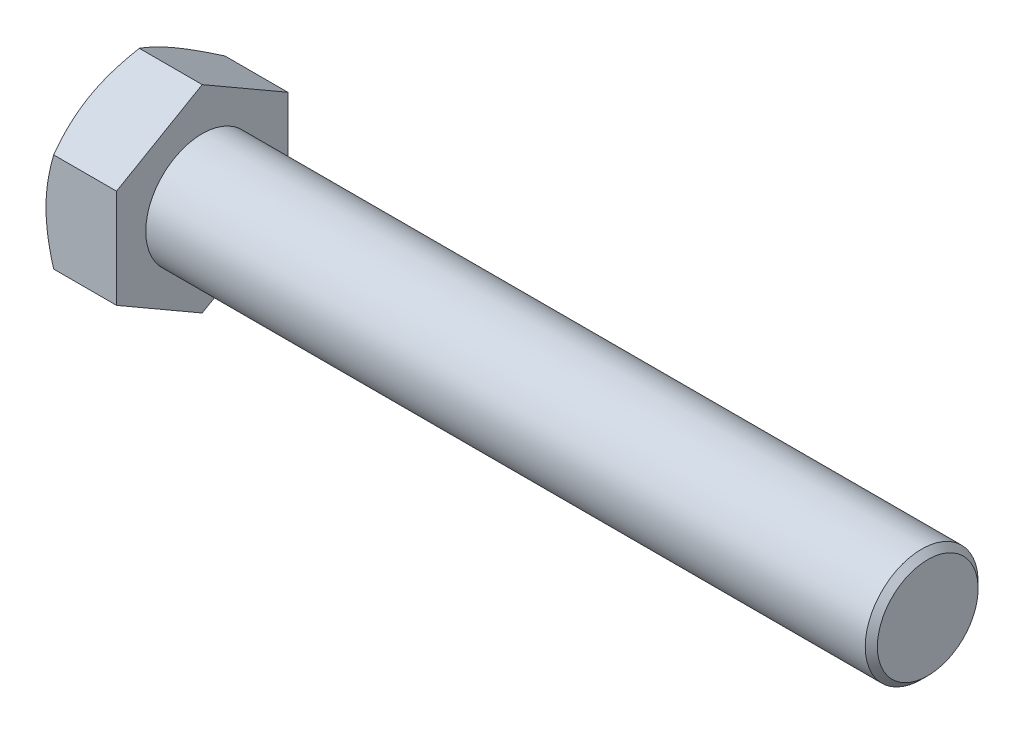
ISO-10303-21;
HEADER;
FILE_DESCRIPTION(('STEP AP214'),'2;1');
FILE_NAME('part.step','',(''),(''),'','','');
FILE_SCHEMA(('AUTOMOTIVE_DESIGN { 1 0 10303 214 1 1 1 1 }'));
ENDSEC;
DATA;
#1=APPLICATION_CONTEXT('core data for automotive mechanical design processes');
#2=APPLICATION_PROTOCOL_DEFINITION('international standard','automotive_design',2000,#1);
#3=PRODUCT_CONTEXT('',#1,'mechanical');
#4=PRODUCT('Part','Part','',(#3));
#5=PRODUCT_RELATED_PRODUCT_CATEGORY('part','',(#4));
#6=PRODUCT_DEFINITION_FORMATION('','',#4);
#7=PRODUCT_DEFINITION_CONTEXT('part definition',#1,'design');
#8=PRODUCT_DEFINITION('design','',#6,#7);
#9=PRODUCT_DEFINITION_SHAPE('','',#8);
#10=(LENGTH_UNIT() NAMED_UNIT(*) SI_UNIT(.MILLI.,.METRE.));
#11=(NAMED_UNIT(*) PLANE_ANGLE_UNIT() SI_UNIT($,.RADIAN.));
#12=(NAMED_UNIT(*) SI_UNIT($,.STERADIAN.) SOLID_ANGLE_UNIT());
#13=UNCERTAINTY_MEASURE_WITH_UNIT(LENGTH_MEASURE(1.E-05),#10,'distance_accuracy_value','');
#14=(GEOMETRIC_REPRESENTATION_CONTEXT(3) GLOBAL_UNCERTAINTY_ASSIGNED_CONTEXT((#13)) GLOBAL_UNIT_ASSIGNED_CONTEXT((#10,
#11,#12)) REPRESENTATION_CONTEXT('',''));
#15=CARTESIAN_POINT('',(0.,0.,0.));
#16=DIRECTION('',(0.,0.,1.));
#17=DIRECTION('',(1.,0.,0.));
#18=AXIS2_PLACEMENT_3D('',#15,#16,#17);
#19=CARTESIAN_POINT('',(35.,73.6121593216773,42.5));
#20=DIRECTION('',(1.,0.,0.));
#21=DIRECTION('',(0.,0.,-1.));
#22=AXIS2_PLACEMENT_3D('',#19,#20,#21);
#23=PLANE('',#22);
#24=DIRECTION('',(0.,0.5,0.866025403784439));
#25=VECTOR('',#24,1.);
#26=CARTESIAN_POINT('',(35.,24.5373864405591,-42.5));
#27=LINE('',#26,#25);
#28=CARTESIAN_POINT('',(35.,24.5373864405591,-42.5));
#29=VERTEX_POINT('',#28);
#30=CARTESIAN_POINT('',(35.,49.0747728811182,0.));
#31=VERTEX_POINT('',#30);
#32=EDGE_CURVE('E156',#29,#31,#27,.T.);
#33=ORIENTED_EDGE('',*,*,#32,.T.);
#34=DIRECTION('',(0.,-0.5,0.866025403784439));
#35=VECTOR('',#34,1.);
#36=CARTESIAN_POINT('',(35.,49.0747728811182,0.));
#37=LINE('',#36,#35);
#38=CARTESIAN_POINT('',(35.,24.5373864405591,42.5));
#39=VERTEX_POINT('',#38);
#40=EDGE_CURVE('E154',#31,#39,#37,.T.);
#41=ORIENTED_EDGE('',*,*,#40,.T.);
#42=DIRECTION('',(0.,-1.,0.));
#43=VECTOR('',#42,1.);
#44=CARTESIAN_POINT('',(35.,24.5373864405591,42.5));
#45=LINE('',#44,#43);
#46=CARTESIAN_POINT('',(35.,-24.5373864405591,42.5));
#47=VERTEX_POINT('',#46);
#48=EDGE_CURVE('E131',#39,#47,#45,.T.);
#49=ORIENTED_EDGE('',*,*,#48,.T.);
#50=DIRECTION('',(0.,-0.5,-0.866025403784438));
#51=VECTOR('',#50,1.);
#52=CARTESIAN_POINT('',(35.,-24.5373864405591,42.5));
#53=LINE('',#52,#51);
#54=CARTESIAN_POINT('',(35.,-49.0747728811182,0.));
#55=VERTEX_POINT('',#54);
#56=EDGE_CURVE('E151',#47,#55,#53,.T.);
#57=ORIENTED_EDGE('',*,*,#56,.T.);
#58=DIRECTION('',(0.,0.5,-0.866025403784439));
#59=VECTOR('',#58,1.);
#60=CARTESIAN_POINT('',(35.,-49.0747728811182,0.));
#61=LINE('',#60,#59);
#62=CARTESIAN_POINT('',(35.,-24.5373864405591,-42.5));
#63=VERTEX_POINT('',#62);
#64=EDGE_CURVE('E149',#55,#63,#61,.T.);
#65=ORIENTED_EDGE('',*,*,#64,.T.);
#66=DIRECTION('',(0.,1.,0.));
#67=VECTOR('',#66,1.);
#68=CARTESIAN_POINT('',(35.,-24.5373864405591,-42.5));
#69=LINE('',#68,#67);
#70=EDGE_CURVE('E147',#63,#29,#69,.T.);
#71=ORIENTED_EDGE('',*,*,#70,.T.);
#72=EDGE_LOOP('',(#33,#41,#49,#57,#65,#71));
#73=FACE_BOUND('',#72,.T.);
#74=CARTESIAN_POINT('',(35.,0.,0.));
#75=DIRECTION('',(1.,0.,0.));
#76=DIRECTION('',(0.,0.,-1.));
#77=AXIS2_PLACEMENT_3D('',#74,#75,#76);
#78=CIRCLE('',#77,28.);
#79=CARTESIAN_POINT('',(35.,0.,-28.));
#80=VERTEX_POINT('',#79);
#81=EDGE_CURVE('E249',#80,#80,#78,.F.);
#82=ORIENTED_EDGE('',*,*,#81,.T.);
#83=EDGE_LOOP('',(#82));
#84=FACE_BOUND('',#83,.T.);
#85=ADVANCED_FACE('F38',(#73,#84),#23,.T.);
#86=CARTESIAN_POINT('',(35.,24.5373864405591,-42.5));
#87=DIRECTION('',(0.,-0.866025403784439,0.5));
#88=DIRECTION('',(0.,-0.5,-0.866025403784439));
#89=AXIS2_PLACEMENT_3D('',#86,#87,#88);
#90=PLANE('',#89);
#91=CARTESIAN_POINT('',(3.79601355967614,49.074888351172,0.000199999999988795));
#92=CARTESIAN_POINT('',(3.4846612351009,48.5355680233465,-0.933930209348483));
#93=CARTESIAN_POINT('',(3.18743784790292,47.9941440595373,-1.87170402310136));
#94=CARTESIAN_POINT('',(2.62517624588161,46.90695457112,-3.75477145449502));
#95=CARTESIAN_POINT('',(2.36014861666376,46.361187681111,-4.70006743707938));
#96=CARTESIAN_POINT('',(1.86583585739942,45.264245960774,-6.60002622964503));
#97=CARTESIAN_POINT('',(1.63663608070645,44.7130614438689,-7.55470581726998));
#98=CARTESIAN_POINT('',(1.21891652386304,43.6068859100205,-9.4706580439851));
#99=CARTESIAN_POINT('',(1.0303926912264,43.0518952779647,-10.4319300164306));
#100=CARTESIAN_POINT('',(0.702027550264062,41.9522934407274,-12.3364962666216));
#101=CARTESIAN_POINT('',(0.561100329653021,41.407763796981,-13.2796492758177));
#102=CARTESIAN_POINT('',(0.324798328837742,40.3162094718984,-15.1702768260823));
#103=CARTESIAN_POINT('',(0.229424425499353,39.7691847427384,-16.1177514499841));
#104=CARTESIAN_POINT('',(0.0866371682155466,38.6742164573787,-18.0142921529036));
#105=CARTESIAN_POINT('',(0.0391668243494614,38.1262747716414,-18.9633549921855));
#106=CARTESIAN_POINT('',(-0.00679237042740302,37.0298856973257,-20.8623565737638));
#107=CARTESIAN_POINT('',(-0.00528273499366041,36.4814383248985,-21.8122952880853));
#108=CARTESIAN_POINT('',(0.0432959793248552,35.4561136678518,-23.5882096883434));
#109=CARTESIAN_POINT('',(0.0844413308846886,34.9791632987355,-24.4143119603416));
#110=CARTESIAN_POINT('',(0.20299436275713,34.0264000417383,-26.0645463290454));
#111=CARTESIAN_POINT('',(0.280401523614526,33.5505871376613,-26.8886784538037));
#112=CARTESIAN_POINT('',(0.470132114759841,32.6002802320365,-28.5346582971295));
#113=CARTESIAN_POINT('',(0.582487117408567,32.1257878160891,-29.3565032693565));
#114=CARTESIAN_POINT('',(0.840141981245277,31.1790583236863,-30.996286851222));
#115=CARTESIAN_POINT('',(0.98544170287185,30.7068212376855,-31.8142254773936));
#116=CARTESIAN_POINT('',(1.31023640468112,29.7545766530747,-33.4635614791719));
#117=CARTESIAN_POINT('',(1.49041542945027,29.2746277415104,-34.2948573790386));
#118=CARTESIAN_POINT('',(1.88016163748601,28.3176673988035,-35.9523613134355));
#119=CARTESIAN_POINT('',(2.08973280360964,27.8406563749271,-36.77856864256));
#120=CARTESIAN_POINT('',(2.53509189002912,26.8906903273177,-38.4239581024848));
#121=CARTESIAN_POINT('',(2.77082850979464,26.4177292587549,-39.2431507032376));
#122=CARTESIAN_POINT('',(3.26616671829671,25.4750783643301,-40.8758699461816));
#123=CARTESIAN_POINT('',(3.5257615809168,25.0053876564132,-41.6893981161367));
#124=CARTESIAN_POINT('',(3.79601355967614,24.5372709705053,-42.5002));
#125=B_SPLINE_CURVE_WITH_KNOTS('',3,(#91,#92,#93,#94,#95,#96,#97,#98,#99,#100,#101,#102,#103,
#104,#105,#106,#107,#108,#109,#110,#111,#112,#113,#114,#115,#116,#117,#118,#119,#120,#121,#122,
#123,#124),.UNSPECIFIED.,.F.,.F.,(4,2,2,2,2,2,2,2,2,2,2,2,2,2,2,2,4),(0.,3.36812217403918,
6.73734876890974,10.1144834694338,13.4912815553319,16.7848038976105,20.0783896350721,
23.3680524226456,26.6576135480413,29.52128658111,32.3849185929383,35.2511452002378,
38.1173596657688,41.0468447452424,43.9767271762963,46.9009634378682,49.824377812827),.UNSPECIFIED.);
#126=CARTESIAN_POINT('',(3.79594689277418,49.0747728811182,0.));
#127=VERTEX_POINT('',#126);
#128=CARTESIAN_POINT('',(0.,36.8060796608386,-21.25));
#129=VERTEX_POINT('',#128);
#130=EDGE_CURVE('E55',#127,#129,#125,.T.);
#131=ORIENTED_EDGE('',*,*,#130,.F.);
#132=DIRECTION('',(-1.,0.,0.));
#133=VECTOR('',#132,1.);
#134=CARTESIAN_POINT('',(35.,49.0747728811182,0.));
#135=LINE('',#134,#133);
#136=EDGE_CURVE('E132',#31,#127,#135,.T.);
#137=ORIENTED_EDGE('',*,*,#136,.F.);
#138=ORIENTED_EDGE('',*,*,#32,.F.);
#139=DIRECTION('',(-1.,0.,0.));
#140=VECTOR('',#139,1.);
#141=CARTESIAN_POINT('',(35.,24.5373864405591,-42.5));
#142=LINE('',#141,#140);
#143=CARTESIAN_POINT('',(3.79594689277418,24.5373864405591,-42.5));
#144=VERTEX_POINT('',#143);
#145=EDGE_CURVE('E144',#29,#144,#142,.T.);
#146=ORIENTED_EDGE('',*,*,#145,.T.);
#147=EDGE_CURVE('E203',#129,#144,#125,.T.);
#148=ORIENTED_EDGE('',*,*,#147,.F.);
#149=EDGE_LOOP('',(#131,#137,#138,#146,#148));
#150=FACE_BOUND('',#149,.T.);
#151=ADVANCED_FACE('F40',(#150),#90,.F.);
#152=CARTESIAN_POINT('',(35.,49.0747728811182,0.));
#153=DIRECTION('',(0.,-0.866025403784439,-0.5));
#154=DIRECTION('',(0.,0.5,-0.866025403784439));
#155=AXIS2_PLACEMENT_3D('',#152,#153,#154);
#156=PLANE('',#155);
#157=CARTESIAN_POINT('',(3.79601355967614,24.5372709705053,42.5002));
#158=CARTESIAN_POINT('',(3.48466123510091,25.0765912983308,41.5660697906515));
#159=CARTESIAN_POINT('',(3.18743784790293,25.61801526214,40.6282959768986));
#160=CARTESIAN_POINT('',(2.62517624588161,26.7052047505573,38.745228545505));
#161=CARTESIAN_POINT('',(2.36014861666375,27.2509716405663,37.7999325629206));
#162=CARTESIAN_POINT('',(1.86583585739941,28.3479133609032,35.899973770355));
#163=CARTESIAN_POINT('',(1.63663608070645,28.8990978778084,34.94529418273));
#164=CARTESIAN_POINT('',(1.21891652386304,30.0052734116568,33.0293419560149));
#165=CARTESIAN_POINT('',(1.0303926912264,30.5602640437126,32.0680699835694));
#166=CARTESIAN_POINT('',(0.702027550264059,31.6598658809499,30.1635037333784));
#167=CARTESIAN_POINT('',(0.56110032965302,32.2043955246963,29.2203507241823));
#168=CARTESIAN_POINT('',(0.324798328837746,33.2959498497789,27.3297231739177));
#169=CARTESIAN_POINT('',(0.229424425499359,33.8429745789389,26.3822485500159));
#170=CARTESIAN_POINT('',(0.0866371682155499,34.9379428642985,24.4857078470964));
#171=CARTESIAN_POINT('',(0.0391668243494593,35.4858845500358,23.5366450078145));
#172=CARTESIAN_POINT('',(-0.00679237042741095,36.5822736243516,21.6376434262362));
#173=CARTESIAN_POINT('',(-0.00528273499366863,37.1307209967787,20.6877047119147));
#174=CARTESIAN_POINT('',(0.0432959793248491,38.1560456538255,18.9117903116566));
#175=CARTESIAN_POINT('',(0.0844413308846847,38.6329960229418,18.0856880396584));
#176=CARTESIAN_POINT('',(0.202994362757124,39.585759279939,16.4354536709545));
#177=CARTESIAN_POINT('',(0.280401523614515,40.061572184016,15.6113215461963));
#178=CARTESIAN_POINT('',(0.470132114759831,41.0118790896408,13.9653417028705));
#179=CARTESIAN_POINT('',(0.582487117408563,41.4863715055882,13.1434967306435));
#180=CARTESIAN_POINT('',(0.840141981245273,42.433100997991,11.503713148778));
#181=CARTESIAN_POINT('',(0.985441702871842,42.9053380839918,10.6857745226064));
#182=CARTESIAN_POINT('',(1.31023640468112,43.8575826686026,9.03643852082807));
#183=CARTESIAN_POINT('',(1.49041542945026,44.3375315801669,8.20514262096134));
#184=CARTESIAN_POINT('',(1.88016163748601,45.2944919228737,6.54763868656452));
#185=CARTESIAN_POINT('',(2.08973280360965,45.7715029467502,5.72143135743999));
#186=CARTESIAN_POINT('',(2.53509189002912,46.7214689943596,4.07604189751519));
#187=CARTESIAN_POINT('',(2.77082850979464,47.1944300629224,3.2568492967624));
#188=CARTESIAN_POINT('',(3.2661667182967,48.1370809573472,1.62413005381835));
#189=CARTESIAN_POINT('',(3.5257615809168,48.6067716652641,0.810601883863296));
#190=CARTESIAN_POINT('',(3.79601355967614,49.074888351172,-0.000200000000011259));
#191=B_SPLINE_CURVE_WITH_KNOTS('',3,(#157,#158,#159,#160,#161,#162,#163,#164,#165,#166,#167,
#168,#169,#170,#171,#172,#173,#174,#175,#176,#177,#178,#179,#180,#181,#182,#183,#184,#185,#186,
#187,#188,#189,#190),.UNSPECIFIED.,.F.,.F.,(4,2,2,2,2,2,2,2,2,2,2,2,2,2,2,2,4),(0.,
3.36812217403917,6.73734876890975,10.1144834694338,13.4912815553319,16.7848038976105,
20.0783896350722,23.3680524226456,26.6576135480413,29.52128658111,32.3849185929383,
35.2511452002378,38.1173596657688,41.0468447452424,43.9767271762963,46.9009634378682,
49.824377812827),.UNSPECIFIED.);
#192=CARTESIAN_POINT('',(3.79594689277418,24.5373864405591,42.5));
#193=VERTEX_POINT('',#192);
#194=CARTESIAN_POINT('',(0.,36.8060796608386,21.25));
#195=VERTEX_POINT('',#194);
#196=EDGE_CURVE('E62',#193,#195,#191,.T.);
#197=ORIENTED_EDGE('',*,*,#196,.F.);
#198=DIRECTION('',(-1.,0.,0.));
#199=VECTOR('',#198,1.);
#200=CARTESIAN_POINT('',(35.,24.5373864405591,42.5));
#201=LINE('',#200,#199);
#202=EDGE_CURVE('E124',#39,#193,#201,.T.);
#203=ORIENTED_EDGE('',*,*,#202,.F.);
#204=ORIENTED_EDGE('',*,*,#40,.F.);
#205=ORIENTED_EDGE('',*,*,#136,.T.);
#206=EDGE_CURVE('E127',#195,#127,#191,.T.);
#207=ORIENTED_EDGE('',*,*,#206,.F.);
#208=EDGE_LOOP('',(#197,#203,#204,#205,#207));
#209=FACE_BOUND('',#208,.T.);
#210=ADVANCED_FACE('F123',(#209),#156,.F.);
#211=CARTESIAN_POINT('',(35.,24.5373864405591,42.5));
#212=DIRECTION('',(0.,0.,-1.));
#213=DIRECTION('',(-1.,0.,0.));
#214=AXIS2_PLACEMENT_3D('',#211,#212,#213);
#215=PLANE('',#214);
#216=CARTESIAN_POINT('',(20.3373849756811,-65.0767648933127,42.5));
#217=CARTESIAN_POINT('',(19.8864107332064,-64.1438049344974,42.5));
#218=CARTESIAN_POINT('',(19.4377629457099,-63.2097164514917,42.5));
#219=CARTESIAN_POINT('',(18.5456711466403,-61.3390459041856,42.5));
#220=CARTESIAN_POINT('',(18.1022271922459,-60.4024638126244,42.5));
#221=CARTESIAN_POINT('',(17.2210290868867,-58.5264308191296,42.5));
#222=CARTESIAN_POINT('',(16.7832759142613,-57.5869794573265,42.5));
#223=CARTESIAN_POINT('',(15.9141917832269,-55.7051120042433,42.5));
#224=CARTESIAN_POINT('',(15.482860808499,-54.762695920504,42.5));
#225=CARTESIAN_POINT('',(14.6249118759366,-52.8692072404987,42.5));
#226=CARTESIAN_POINT('',(14.1983350741895,-51.9181159821514,42.5));
#227=CARTESIAN_POINT('',(13.3532955085725,-50.0123364029343,42.5));
#228=CARTESIAN_POINT('',(12.9348327177442,-49.0576480940281,42.5));
#229=CARTESIAN_POINT('',(12.1070331158039,-47.1443706129467,42.5));
#230=CARTESIAN_POINT('',(11.6976958917847,-46.1857816195971,42.5));
#231=CARTESIAN_POINT('',(10.8892709446995,-44.2642864735806,42.5));
#232=CARTESIAN_POINT('',(10.490183222656,-43.301380320483,42.5));
#233=CARTESIAN_POINT('',(9.69873914421742,-41.358991222501,42.5));
#234=CARTESIAN_POINT('',(9.30652571730982,-40.3794499563556,42.5));
#235=CARTESIAN_POINT('',(8.53551485726134,-38.415091537272,42.5));
#236=CARTESIAN_POINT('',(8.15671744832537,-37.4302743748189,42.5));
#237=CARTESIAN_POINT('',(7.41429261876891,-35.4547841696776,42.5));
#238=CARTESIAN_POINT('',(7.0506671255764,-34.464110401112,42.5));
#239=CARTESIAN_POINT('',(6.34070151093992,-32.4765835623041,42.5));
#240=CARTESIAN_POINT('',(5.99436131974208,-31.4797305170161,42.5));
#241=CARTESIAN_POINT('',(5.32202587399994,-29.4815411934395,42.5));
#242=CARTESIAN_POINT('',(4.99598844871395,-28.4802191760506,42.5));
#243=CARTESIAN_POINT('',(4.366091591983,-26.4706437672383,42.5));
#244=CARTESIAN_POINT('',(4.06223253849912,-25.4623902580094,42.5));
#245=CARTESIAN_POINT('',(3.18838018165586,-22.4272420041793,42.5));
#246=CARTESIAN_POINT('',(2.65584808319442,-20.3891895568575,42.5));
#247=CARTESIAN_POINT('',(1.95165311664511,-17.3102620178618,42.5));
#248=CARTESIAN_POINT('',(1.73265261902976,-16.2800927859936,42.5));
#249=CARTESIAN_POINT('',(1.32964364489703,-14.2128889820796,42.5));
#250=CARTESIAN_POINT('',(1.14563438253574,-13.1758545647556,42.5));
#251=CARTESIAN_POINT('',(0.81587021038758,-11.0956277796535,42.5));
#252=CARTESIAN_POINT('',(0.670117650067306,-10.0524350376938,42.5));
#253=CARTESIAN_POINT('',(0.419794443517903,-7.96108365892405,42.5));
#254=CARTESIAN_POINT('',(0.315223846232988,-6.91292501621351,42.5));
#255=CARTESIAN_POINT('',(0.150079316867718,-4.81982610667982,42.5));
#256=CARTESIAN_POINT('',(0.0892300992894995,-3.77490769670364,42.5));
#257=CARTESIAN_POINT('',(0.0118497928145849,-1.68343343633418,42.5));
#258=CARTESIAN_POINT('',(-0.00468196570370313,-0.636877610920773,42.5));
#259=CARTESIAN_POINT('',(0.00695889112113209,1.45568967043007,42.5));
#260=CARTESIAN_POINT('',(0.0351191399670896,2.5017011968687,42.5));
#261=CARTESIAN_POINT('',(0.135465555969031,4.59165687068852,42.5));
#262=CARTESIAN_POINT('',(0.20765366117176,5.63560092503281,42.5));
#263=CARTESIAN_POINT('',(0.367668776435923,7.42128904251799,42.5));
#264=CARTESIAN_POINT('',(0.445101670924851,8.16398533023065,42.5));
#265=CARTESIAN_POINT('',(0.620690588262044,9.6469331686952,42.5));
#266=CARTESIAN_POINT('',(0.718847219910224,10.3871846469771,42.5));
#267=CARTESIAN_POINT('',(1.04295711165632,12.6037313052206,42.5));
#268=CARTESIAN_POINT('',(1.29854540233427,14.0757647504112,42.5));
#269=CARTESIAN_POINT('',(1.88009693070641,17.0089295941617,42.5));
#270=CARTESIAN_POINT('',(2.20621102811323,18.4700305658405,42.5));
#271=CARTESIAN_POINT('',(2.91867799572115,21.3773037465817,42.5));
#272=CARTESIAN_POINT('',(3.30502860131093,22.8234765146964,42.5));
#273=CARTESIAN_POINT('',(4.13838357501128,25.7349070211425,42.5));
#274=CARTESIAN_POINT('',(4.58659928876158,27.1998153611595,42.5));
#275=CARTESIAN_POINT('',(5.52765504538532,30.1153033095138,42.5));
#276=CARTESIAN_POINT('',(6.02049911654051,31.5658816112486,42.5));
#277=CARTESIAN_POINT('',(6.78613919153744,33.7277418983106,42.5));
#278=CARTESIAN_POINT('',(7.04497697426377,34.444015251103,42.5));
#279=CARTESIAN_POINT('',(7.57104172116878,35.8734846685127,42.5));
#280=CARTESIAN_POINT('',(7.83826874356843,36.5866807117344,42.5));
#281=CARTESIAN_POINT('',(8.38027540616651,38.0099126902482,42.5));
#282=CARTESIAN_POINT('',(8.65505243553981,38.7199496216951,42.5));
#283=CARTESIAN_POINT('',(9.21159032919374,40.1372592183872,42.5));
#284=CARTESIAN_POINT('',(9.49335099614508,40.8445319610849,42.5));
#285=CARTESIAN_POINT('',(9.77828319450634,41.5505180173351,42.5));
#286=B_SPLINE_CURVE_WITH_KNOTS('',3,(#216,#217,#218,#219,#220,#221,#222,#223,#224,#225,#226,
#227,#228,#229,#230,#231,#232,#233,#234,#235,#236,#237,#238,#239,#240,#241,#242,#243,#244,#245,
#246,#247,#248,#249,#250,#251,#252,#253,#254,#255,#256,#257,#258,#259,#260,#261,#262,#263,#264,
#265,#266,#267,#268,#269,#270,#271,#272,#273,#274,#275,#276,#277,#278,#279,#280,#281,#282,#283,
#284,#285),.UNSPECIFIED.,.F.,.F.,(4,2,2,2,2,2,2,2,2,2,2,2,2,2,2,2,2,2,2,2,2,2,2,2,2,2,2,2,2,2,2,
2,2,2,4),(0.,3.10872020331132,6.21747453270423,9.32675642278921,12.4360304107818,
15.5631168850267,18.6901929678832,21.8171272706611,24.9440618853776,28.1094116203001,
31.2747670657947,34.4405234186878,37.6062669953131,40.7651991719559,43.924185170169,
50.2397177156962,53.398810737976,56.5578328039926,59.7170488303034,62.8762686112889,
66.0154182231623,69.1545204032954,72.292754129923,75.4311260073298,77.6710037812604,
79.9109473650965,84.390996871465,88.8807260204892,93.3702864173535,97.9652822240581,
102.560693202297,104.845472434615,107.130267526711,109.414282230862,111.698232471421),.UNSPECIFIED.);
#287=CARTESIAN_POINT('',(3.79594689277418,-24.5373864405591,42.5));
#288=VERTEX_POINT('',#287);
#289=CARTESIAN_POINT('',(0.,0.,42.5));
#290=VERTEX_POINT('',#289);
#291=EDGE_CURVE('E117',#288,#290,#286,.T.);
#292=ORIENTED_EDGE('',*,*,#291,.F.);
#293=DIRECTION('',(-1.,0.,0.));
#294=VECTOR('',#293,1.);
#295=CARTESIAN_POINT('',(35.,-24.5373864405591,42.5));
#296=LINE('',#295,#294);
#297=EDGE_CURVE('E133',#47,#288,#296,.T.);
#298=ORIENTED_EDGE('',*,*,#297,.F.);
#299=ORIENTED_EDGE('',*,*,#48,.F.);
#300=ORIENTED_EDGE('',*,*,#202,.T.);
#301=EDGE_CURVE('E109',#290,#193,#286,.T.);
#302=ORIENTED_EDGE('',*,*,#301,.F.);
#303=EDGE_LOOP('',(#292,#298,#299,#300,#302));
#304=FACE_BOUND('',#303,.T.);
#305=ADVANCED_FACE('F129',(#304),#215,.F.);
#306=CARTESIAN_POINT('',(35.,-24.5373864405591,42.5));
#307=DIRECTION('',(0.,0.866025403784439,-0.5));
#308=DIRECTION('',(0.,0.5,0.866025403784439));
#309=AXIS2_PLACEMENT_3D('',#306,#307,#308);
#310=PLANE('',#309);
#311=CARTESIAN_POINT('',(3.79601355967615,-49.074888351172,-0.000199999999986498));
#312=CARTESIAN_POINT('',(3.48466123510091,-48.5355680233465,0.933930209348491));
#313=CARTESIAN_POINT('',(3.18743784790293,-47.9941440595373,1.87170402310137));
#314=CARTESIAN_POINT('',(2.62517624588162,-46.90695457112,3.75477145449503));
#315=CARTESIAN_POINT('',(2.36014861666376,-46.361187681111,4.70006743707938));
#316=CARTESIAN_POINT('',(1.86583585739942,-45.264245960774,6.60002622964504));
#317=CARTESIAN_POINT('',(1.63663608070645,-44.7130614438689,7.55470581727));
#318=CARTESIAN_POINT('',(1.21891652386304,-43.6068859100205,9.47065804398512));
#319=CARTESIAN_POINT('',(1.03039269122639,-43.0518952779647,10.4319300164306));
#320=CARTESIAN_POINT('',(0.702027550264059,-41.9522934407274,12.3364962666216));
#321=CARTESIAN_POINT('',(0.561100329653026,-41.407763796981,13.2796492758177));
#322=CARTESIAN_POINT('',(0.324798328837752,-40.3162094718984,15.1702768260823));
#323=CARTESIAN_POINT('',(0.22942442549936,-39.7691847427384,16.1177514499841));
#324=CARTESIAN_POINT('',(0.0866371682155513,-38.6742164573787,18.0142921529036));
#325=CARTESIAN_POINT('',(0.0391668243494662,-38.1262747716414,18.9633549921855));
#326=CARTESIAN_POINT('',(-0.00679237042740382,-37.0298856973257,20.8623565737638));
#327=CARTESIAN_POINT('',(-0.00528273499366689,-36.4814383248985,21.8122952880853));
#328=CARTESIAN_POINT('',(0.0432959793248495,-35.4561136678518,23.5882096883434));
#329=CARTESIAN_POINT('',(0.084441330884688,-34.9791632987355,24.4143119603416));
#330=CARTESIAN_POINT('',(0.202994362757132,-34.0264000417383,26.0645463290455));
#331=CARTESIAN_POINT('',(0.280401523614526,-33.5505871376613,26.8886784538037));
#332=CARTESIAN_POINT('',(0.470132114759843,-32.6002802320365,28.5346582971295));
#333=CARTESIAN_POINT('',(0.582487117408573,-32.1257878160891,29.3565032693565));
#334=CARTESIAN_POINT('',(0.840141981245282,-31.1790583236863,30.996286851222));
#335=CARTESIAN_POINT('',(0.98544170287185,-30.7068212376855,31.8142254773936));
#336=CARTESIAN_POINT('',(1.31023640468113,-29.7545766530747,33.4635614791719));
#337=CARTESIAN_POINT('',(1.49041542945027,-29.2746277415104,34.2948573790387));
#338=CARTESIAN_POINT('',(1.88016163748602,-28.3176673988035,35.9523613134355));
#339=CARTESIAN_POINT('',(2.08973280360965,-27.8406563749271,36.77856864256));
#340=CARTESIAN_POINT('',(2.53509189002912,-26.8906903273177,38.4239581024848));
#341=CARTESIAN_POINT('',(2.77082850979465,-26.4177292587549,39.2431507032376));
#342=CARTESIAN_POINT('',(3.26616671829671,-25.4750783643301,40.8758699461816));
#343=CARTESIAN_POINT('',(3.52576158091681,-25.0053876564132,41.6893981161367));
#344=CARTESIAN_POINT('',(3.79601355967614,-24.5372709705053,42.5002));
#345=B_SPLINE_CURVE_WITH_KNOTS('',3,(#311,#312,#313,#314,#315,#316,#317,#318,#319,#320,#321,
#322,#323,#324,#325,#326,#327,#328,#329,#330,#331,#332,#333,#334,#335,#336,#337,#338,#339,#340,
#341,#342,#343,#344),.UNSPECIFIED.,.F.,.F.,(4,2,2,2,2,2,2,2,2,2,2,2,2,2,2,2,4),(0.,
3.36812217403918,6.73734876890976,10.1144834694338,13.4912815553319,16.7848038976105,
20.0783896350722,23.3680524226456,26.6576135480413,29.52128658111,32.3849185929383,
35.2511452002378,38.1173596657688,41.0468447452424,43.9767271762963,46.9009634378682,
49.824377812827),.UNSPECIFIED.);
#346=CARTESIAN_POINT('',(3.79594689277418,-49.0747728811182,0.));
#347=VERTEX_POINT('',#346);
#348=CARTESIAN_POINT('',(0.,-36.8060796608386,21.25));
#349=VERTEX_POINT('',#348);
#350=EDGE_CURVE('E208',#347,#349,#345,.T.);
#351=ORIENTED_EDGE('',*,*,#350,.F.);
#352=DIRECTION('',(-1.,0.,0.));
#353=VECTOR('',#352,1.);
#354=CARTESIAN_POINT('',(35.,-49.0747728811182,0.));
#355=LINE('',#354,#353);
#356=EDGE_CURVE('E136',#55,#347,#355,.T.);
#357=ORIENTED_EDGE('',*,*,#356,.F.);
#358=ORIENTED_EDGE('',*,*,#56,.F.);
#359=ORIENTED_EDGE('',*,*,#297,.T.);
#360=EDGE_CURVE('E118',#349,#288,#345,.T.);
#361=ORIENTED_EDGE('',*,*,#360,.F.);
#362=EDGE_LOOP('',(#351,#357,#358,#359,#361));
#363=FACE_BOUND('',#362,.T.);
#364=ADVANCED_FACE('F214',(#363),#310,.F.);
#365=CARTESIAN_POINT('',(35.,-49.0747728811182,0.));
#366=DIRECTION('',(0.,0.866025403784439,0.5));
#367=DIRECTION('',(0.,-0.5,0.866025403784439));
#368=AXIS2_PLACEMENT_3D('',#365,#366,#367);
#369=PLANE('',#368);
#370=CARTESIAN_POINT('',(3.79601355967614,-24.5372709705053,-42.5002));
#371=CARTESIAN_POINT('',(3.48466123510091,-25.0765912983308,-41.5660697906515));
#372=CARTESIAN_POINT('',(3.18743784790293,-25.61801526214,-40.6282959768986));
#373=CARTESIAN_POINT('',(2.62517624588161,-26.7052047505573,-38.745228545505));
#374=CARTESIAN_POINT('',(2.36014861666375,-27.2509716405663,-37.7999325629206));
#375=CARTESIAN_POINT('',(1.86583585739941,-28.3479133609033,-35.899973770355));
#376=CARTESIAN_POINT('',(1.63663608070645,-28.8990978778084,-34.94529418273));
#377=CARTESIAN_POINT('',(1.21891652386304,-30.0052734116568,-33.0293419560149));
#378=CARTESIAN_POINT('',(1.0303926912264,-30.5602640437126,-32.0680699835694));
#379=CARTESIAN_POINT('',(0.702027550264061,-31.6598658809499,-30.1635037333784));
#380=CARTESIAN_POINT('',(0.561100329653025,-32.2043955246963,-29.2203507241823));
#381=CARTESIAN_POINT('',(0.32479832883775,-33.2959498497789,-27.3297231739177));
#382=CARTESIAN_POINT('',(0.229424425499359,-33.8429745789389,-26.3822485500159));
#383=CARTESIAN_POINT('',(0.0866371682155488,-34.9379428642985,-24.4857078470964));
#384=CARTESIAN_POINT('',(0.0391668243494619,-35.4858845500358,-23.5366450078145));
#385=CARTESIAN_POINT('',(-0.00679237042740758,-36.5822736243516,-21.6376434262362));
#386=CARTESIAN_POINT('',(-0.00528273499366835,-37.1307209967788,-20.6877047119147));
#387=CARTESIAN_POINT('',(0.0432959793248508,-38.1560456538255,-18.9117903116566));
#388=CARTESIAN_POINT('',(0.0844413308846898,-38.6329960229418,-18.0856880396584));
#389=CARTESIAN_POINT('',(0.202994362757129,-39.585759279939,-16.4354536709546));
#390=CARTESIAN_POINT('',(0.280401523614517,-40.061572184016,-15.6113215461963));
#391=CARTESIAN_POINT('',(0.470132114759835,-41.0118790896408,-13.9653417028705));
#392=CARTESIAN_POINT('',(0.582487117408572,-41.4863715055882,-13.1434967306435));
#393=CARTESIAN_POINT('',(0.840141981245285,-42.433100997991,-11.503713148778));
#394=CARTESIAN_POINT('',(0.985441702871851,-42.9053380839918,-10.6857745226064));
#395=CARTESIAN_POINT('',(1.31023640468112,-43.8575826686026,-9.03643852082807));
#396=CARTESIAN_POINT('',(1.49041542945027,-44.3375315801669,-8.20514262096134));
#397=CARTESIAN_POINT('',(1.88016163748601,-45.2944919228738,-6.54763868656452));
#398=CARTESIAN_POINT('',(2.08973280360965,-45.7715029467502,-5.72143135743999));
#399=CARTESIAN_POINT('',(2.53509189002912,-46.7214689943596,-4.07604189751519));
#400=CARTESIAN_POINT('',(2.77082850979465,-47.1944300629224,-3.2568492967624));
#401=CARTESIAN_POINT('',(3.26616671829671,-48.1370809573472,-1.62413005381835));
#402=CARTESIAN_POINT('',(3.52576158091681,-48.6067716652641,-0.810601883863296));
#403=CARTESIAN_POINT('',(3.79601355967615,-49.074888351172,0.000200000000012491));
#404=B_SPLINE_CURVE_WITH_KNOTS('',3,(#370,#371,#372,#373,#374,#375,#376,#377,#378,#379,#380,
#381,#382,#383,#384,#385,#386,#387,#388,#389,#390,#391,#392,#393,#394,#395,#396,#397,#398,#399,
#400,#401,#402,#403),.UNSPECIFIED.,.F.,.F.,(4,2,2,2,2,2,2,2,2,2,2,2,2,2,2,2,4),(0.,
3.36812217403917,6.73734876890976,10.1144834694338,13.4912815553319,16.7848038976105,
20.0783896350721,23.3680524226455,26.6576135480413,29.52128658111,32.3849185929383,
35.2511452002378,38.1173596657688,41.0468447452424,43.9767271762963,46.9009634378682,
49.824377812827),.UNSPECIFIED.);
#405=CARTESIAN_POINT('',(3.79594689277418,-24.5373864405591,-42.5));
#406=VERTEX_POINT('',#405);
#407=CARTESIAN_POINT('',(0.,-36.8060796608387,-21.25));
#408=VERTEX_POINT('',#407);
#409=EDGE_CURVE('E195',#406,#408,#404,.T.);
#410=ORIENTED_EDGE('',*,*,#409,.F.);
#411=DIRECTION('',(-1.,0.,0.));
#412=VECTOR('',#411,1.);
#413=CARTESIAN_POINT('',(35.,-24.5373864405591,-42.5));
#414=LINE('',#413,#412);
#415=EDGE_CURVE('E141',#63,#406,#414,.T.);
#416=ORIENTED_EDGE('',*,*,#415,.F.);
#417=ORIENTED_EDGE('',*,*,#64,.F.);
#418=ORIENTED_EDGE('',*,*,#356,.T.);
#419=EDGE_CURVE('E213',#408,#347,#404,.T.);
#420=ORIENTED_EDGE('',*,*,#419,.F.);
#421=EDGE_LOOP('',(#410,#416,#417,#418,#420));
#422=FACE_BOUND('',#421,.T.);
#423=ADVANCED_FACE('F217',(#422),#369,.F.);
#424=CARTESIAN_POINT('',(35.,-24.5373864405591,-42.5));
#425=DIRECTION('',(0.,0.,1.));
#426=DIRECTION('',(1.,0.,0.));
#427=AXIS2_PLACEMENT_3D('',#424,#425,#426);
#428=PLANE('',#427);
#429=CARTESIAN_POINT('',(20.3373849756811,-65.0767648933127,-42.5));
#430=CARTESIAN_POINT('',(19.8864107332064,-64.1438049344974,-42.5));
#431=CARTESIAN_POINT('',(19.4377629457099,-63.2097164514917,-42.5));
#432=CARTESIAN_POINT('',(18.5456711466403,-61.3390459041855,-42.5));
#433=CARTESIAN_POINT('',(18.1022271922459,-60.4024638126244,-42.5));
#434=CARTESIAN_POINT('',(17.2210290868867,-58.5264308191296,-42.5));
#435=CARTESIAN_POINT('',(16.7832759142613,-57.5869794573265,-42.5));
#436=CARTESIAN_POINT('',(15.9141917832269,-55.7051120042433,-42.5));
#437=CARTESIAN_POINT('',(15.482860808499,-54.762695920504,-42.5));
#438=CARTESIAN_POINT('',(14.6249118759366,-52.8692072404987,-42.5));
#439=CARTESIAN_POINT('',(14.1983350741895,-51.9181159821514,-42.5));
#440=CARTESIAN_POINT('',(13.3532955085725,-50.0123364029343,-42.5));
#441=CARTESIAN_POINT('',(12.9348327177442,-49.0576480940281,-42.5));
#442=CARTESIAN_POINT('',(12.1070331158039,-47.1443706129466,-42.5));
#443=CARTESIAN_POINT('',(11.6976958917847,-46.1857816195971,-42.5));
#444=CARTESIAN_POINT('',(10.8892709446995,-44.2642864735806,-42.5));
#445=CARTESIAN_POINT('',(10.490183222656,-43.301380320483,-42.5));
#446=CARTESIAN_POINT('',(9.69873914421742,-41.358991222501,-42.5));
#447=CARTESIAN_POINT('',(9.30652571730982,-40.3794499563556,-42.5));
#448=CARTESIAN_POINT('',(8.53551485726134,-38.415091537272,-42.5));
#449=CARTESIAN_POINT('',(8.15671744832537,-37.4302743748189,-42.5));
#450=CARTESIAN_POINT('',(7.4142926187689,-35.4547841696776,-42.5));
#451=CARTESIAN_POINT('',(7.05066712557639,-34.464110401112,-42.5));
#452=CARTESIAN_POINT('',(6.34070151093992,-32.4765835623041,-42.5));
#453=CARTESIAN_POINT('',(5.99436131974208,-31.4797305170161,-42.5));
#454=CARTESIAN_POINT('',(5.32202587399994,-29.4815411934395,-42.5));
#455=CARTESIAN_POINT('',(4.99598844871395,-28.4802191760506,-42.5));
#456=CARTESIAN_POINT('',(4.366091591983,-26.4706437672383,-42.5));
#457=CARTESIAN_POINT('',(4.06223253849912,-25.4623902580094,-42.5));
#458=CARTESIAN_POINT('',(3.18838018165586,-22.4272420041793,-42.5));
#459=CARTESIAN_POINT('',(2.65584808319442,-20.3891895568575,-42.5));
#460=CARTESIAN_POINT('',(1.95165311664511,-17.3102620178618,-42.5));
#461=CARTESIAN_POINT('',(1.73265261902976,-16.2800927859936,-42.5));
#462=CARTESIAN_POINT('',(1.32964364489703,-14.2128889820796,-42.5));
#463=CARTESIAN_POINT('',(1.14563438253574,-13.1758545647556,-42.5));
#464=CARTESIAN_POINT('',(0.81587021038758,-11.0956277796535,-42.5));
#465=CARTESIAN_POINT('',(0.670117650067306,-10.0524350376938,-42.5));
#466=CARTESIAN_POINT('',(0.419794443517903,-7.96108365892405,-42.5));
#467=CARTESIAN_POINT('',(0.315223846232988,-6.91292501621351,-42.5));
#468=CARTESIAN_POINT('',(0.150079316867718,-4.81982610667982,-42.5));
#469=CARTESIAN_POINT('',(0.0892300992894996,-3.77490769670364,-42.5));
#470=CARTESIAN_POINT('',(0.0118497928145849,-1.68343343633418,-42.5));
#471=CARTESIAN_POINT('',(-0.00468196570370323,-0.636877610920773,-42.5));
#472=CARTESIAN_POINT('',(0.00695889112113218,1.45568967043007,-42.5));
#473=CARTESIAN_POINT('',(0.0351191399670898,2.5017011968687,-42.5));
#474=CARTESIAN_POINT('',(0.135465555969031,4.59165687068851,-42.5));
#475=CARTESIAN_POINT('',(0.207653661171759,5.6356009250328,-42.5));
#476=CARTESIAN_POINT('',(0.367668776435923,7.42128904251799,-42.5));
#477=CARTESIAN_POINT('',(0.445101670924851,8.16398533023065,-42.5));
#478=CARTESIAN_POINT('',(0.620690588262044,9.6469331686952,-42.5));
#479=CARTESIAN_POINT('',(0.718847219910224,10.3871846469771,-42.5));
#480=CARTESIAN_POINT('',(1.04295711165632,12.6037313052206,-42.5));
#481=CARTESIAN_POINT('',(1.29854540233427,14.0757647504112,-42.5));
#482=CARTESIAN_POINT('',(1.8800969307064,17.0089295941617,-42.5));
#483=CARTESIAN_POINT('',(2.20621102811322,18.4700305658405,-42.5));
#484=CARTESIAN_POINT('',(2.91867799572115,21.3773037465817,-42.5));
#485=CARTESIAN_POINT('',(3.30502860131093,22.8234765146964,-42.5));
#486=CARTESIAN_POINT('',(4.13838357501128,25.7349070211425,-42.5));
#487=CARTESIAN_POINT('',(4.58659928876158,27.1998153611595,-42.5));
#488=CARTESIAN_POINT('',(5.52765504538531,30.1153033095138,-42.5));
#489=CARTESIAN_POINT('',(6.0204991165405,31.5658816112486,-42.5));
#490=CARTESIAN_POINT('',(6.78613919153744,33.7277418983106,-42.5));
#491=CARTESIAN_POINT('',(7.04497697426377,34.444015251103,-42.5));
#492=CARTESIAN_POINT('',(7.57104172116878,35.8734846685127,-42.5));
#493=CARTESIAN_POINT('',(7.83826874356842,36.5866807117344,-42.5));
#494=CARTESIAN_POINT('',(8.3802754061665,38.0099126902482,-42.5));
#495=CARTESIAN_POINT('',(8.6550524355398,38.7199496216951,-42.5));
#496=CARTESIAN_POINT('',(9.21159032919373,40.1372592183872,-42.5));
#497=CARTESIAN_POINT('',(9.49335099614507,40.8445319610849,-42.5));
#498=CARTESIAN_POINT('',(9.77828319450634,41.5505180173351,-42.5));
#499=B_SPLINE_CURVE_WITH_KNOTS('',3,(#429,#430,#431,#432,#433,#434,#435,#436,#437,#438,#439,
#440,#441,#442,#443,#444,#445,#446,#447,#448,#449,#450,#451,#452,#453,#454,#455,#456,#457,#458,
#459,#460,#461,#462,#463,#464,#465,#466,#467,#468,#469,#470,#471,#472,#473,#474,#475,#476,#477,
#478,#479,#480,#481,#482,#483,#484,#485,#486,#487,#488,#489,#490,#491,#492,#493,#494,#495,#496,
#497,#498),.UNSPECIFIED.,.F.,.F.,(4,2,2,2,2,2,2,2,2,2,2,2,2,2,2,2,2,2,2,2,2,2,2,2,2,2,2,2,2,2,2,
2,2,2,4),(0.,3.10872020331133,6.21747453270423,9.32675642278922,12.4360304107818,
15.5631168850267,18.6901929678833,21.8171272706611,24.9440618853777,28.1094116203001,
31.2747670657947,34.4405234186878,37.6062669953131,40.765199171956,43.9241851701691,
50.2397177156962,53.398810737976,56.5578328039926,59.7170488303034,62.8762686112889,
66.0154182231623,69.1545204032954,72.292754129923,75.4311260073298,77.6710037812604,
79.9109473650965,84.3909968714649,88.8807260204892,93.3702864173535,97.9652822240581,
102.560693202297,104.845472434615,107.130267526711,109.414282230862,111.698232471421),.UNSPECIFIED.);
#500=CARTESIAN_POINT('',(0.,0.,-42.5));
#501=VERTEX_POINT('',#500);
#502=EDGE_CURVE('E377',#144,#501,#499,.F.);
#503=ORIENTED_EDGE('',*,*,#502,.F.);
#504=ORIENTED_EDGE('',*,*,#145,.F.);
#505=ORIENTED_EDGE('',*,*,#70,.F.);
#506=ORIENTED_EDGE('',*,*,#415,.T.);
#507=EDGE_CURVE('E185',#501,#406,#499,.F.);
#508=ORIENTED_EDGE('',*,*,#507,.F.);
#509=EDGE_LOOP('',(#503,#504,#505,#506,#508));
#510=FACE_BOUND('',#509,.T.);
#511=ADVANCED_FACE('F221',(#510),#428,.F.);
#512=CARTESIAN_POINT('',(0.,0.,0.));
#513=DIRECTION('',(1.,0.,0.));
#514=DIRECTION('',(0.,0.,-1.));
#515=AXIS2_PLACEMENT_3D('',#512,#513,#514);
#516=CONICAL_SURFACE('',#515,42.5,1.0471975511966);
#517=ORIENTED_EDGE('',*,*,#409,.T.);
#518=CARTESIAN_POINT('',(0.,0.,0.));
#519=DIRECTION('',(1.,0.,0.));
#520=DIRECTION('',(0.,0.,-1.));
#521=AXIS2_PLACEMENT_3D('',#518,#519,#520);
#522=CIRCLE('',#521,42.5);
#523=EDGE_CURVE('E43',#408,#501,#522,.T.);
#524=ORIENTED_EDGE('',*,*,#523,.T.);
#525=ORIENTED_EDGE('',*,*,#507,.T.);
#526=EDGE_LOOP('',(#517,#524,#525));
#527=FACE_BOUND('',#526,.T.);
#528=ADVANCED_FACE('F178',(#527),#516,.T.);
#529=ORIENTED_EDGE('',*,*,#350,.T.);
#530=EDGE_CURVE('E379',#349,#408,#522,.T.);
#531=ORIENTED_EDGE('',*,*,#530,.T.);
#532=ORIENTED_EDGE('',*,*,#419,.T.);
#533=EDGE_LOOP('',(#529,#531,#532));
#534=FACE_BOUND('',#533,.T.);
#535=ADVANCED_FACE('F176',(#534),#516,.T.);
#536=ORIENTED_EDGE('',*,*,#291,.T.);
#537=EDGE_CURVE('E391',#290,#349,#522,.T.);
#538=ORIENTED_EDGE('',*,*,#537,.T.);
#539=ORIENTED_EDGE('',*,*,#360,.T.);
#540=EDGE_LOOP('',(#536,#538,#539));
#541=FACE_BOUND('',#540,.T.);
#542=ADVANCED_FACE('F171',(#541),#516,.T.);
#543=ORIENTED_EDGE('',*,*,#301,.T.);
#544=ORIENTED_EDGE('',*,*,#196,.T.);
#545=CARTESIAN_POINT('',(0.,0.,0.));
#546=DIRECTION('',(-1.,0.,0.));
#547=DIRECTION('',(0.,0.,1.));
#548=AXIS2_PLACEMENT_3D('',#545,#546,#547);
#549=CIRCLE('',#548,42.5);
#550=EDGE_CURVE('E112',#290,#195,#549,.T.);
#551=ORIENTED_EDGE('',*,*,#550,.F.);
#552=EDGE_LOOP('',(#543,#544,#551));
#553=FACE_BOUND('',#552,.T.);
#554=ADVANCED_FACE('F110',(#553),#516,.T.);
#555=ORIENTED_EDGE('',*,*,#206,.T.);
#556=ORIENTED_EDGE('',*,*,#130,.T.);
#557=EDGE_CURVE('E48',#129,#195,#522,.T.);
#558=ORIENTED_EDGE('',*,*,#557,.T.);
#559=EDGE_LOOP('',(#555,#556,#558));
#560=FACE_BOUND('',#559,.T.);
#561=ADVANCED_FACE('F237',(#560),#516,.T.);
#562=ORIENTED_EDGE('',*,*,#147,.T.);
#563=ORIENTED_EDGE('',*,*,#502,.T.);
#564=EDGE_CURVE('E11',#501,#129,#522,.T.);
#565=ORIENTED_EDGE('',*,*,#564,.T.);
#566=EDGE_LOOP('',(#562,#563,#565));
#567=FACE_BOUND('',#566,.T.);
#568=ADVANCED_FACE('F228',(#567),#516,.T.);
#569=CARTESIAN_POINT('',(0.,73.6121593216773,42.5));
#570=DIRECTION('',(1.,0.,0.));
#571=DIRECTION('',(0.,0.,-1.));
#572=AXIS2_PLACEMENT_3D('',#569,#570,#571);
#573=PLANE('',#572);
#574=ORIENTED_EDGE('',*,*,#564,.F.);
#575=ORIENTED_EDGE('',*,*,#523,.F.);
#576=ORIENTED_EDGE('',*,*,#530,.F.);
#577=ORIENTED_EDGE('',*,*,#537,.F.);
#578=ORIENTED_EDGE('',*,*,#550,.T.);
#579=ORIENTED_EDGE('',*,*,#557,.F.);
#580=EDGE_LOOP('',(#574,#575,#576,#577,#578,#579));
#581=FACE_BOUND('',#580,.T.);
#582=ADVANCED_FACE('F226',(#581),#573,.F.);
#583=CARTESIAN_POINT('',(0.,0.,0.));
#584=DIRECTION('',(-1.,0.,0.));
#585=DIRECTION('',(0.,0.,1.));
#586=AXIS2_PLACEMENT_3D('',#583,#584,#585);
#587=CYLINDRICAL_SURFACE('',#586,28.);
#588=ORIENTED_EDGE('',*,*,#81,.F.);
#589=EDGE_LOOP('',(#588));
#590=FACE_BOUND('',#589,.T.);
#591=CARTESIAN_POINT('',(391.9855,0.,0.));
#592=DIRECTION('',(-1.,0.,0.));
#593=DIRECTION('',(0.,0.,1.));
#594=AXIS2_PLACEMENT_3D('',#591,#592,#593);
#595=CIRCLE('',#594,28.);
#596=CARTESIAN_POINT('',(391.9855,0.,28.));
#597=VERTEX_POINT('',#596);
#598=EDGE_CURVE('E250',#597,#597,#595,.T.);
#599=ORIENTED_EDGE('',*,*,#598,.T.);
#600=EDGE_LOOP('',(#599));
#601=FACE_BOUND('',#600,.T.);
#602=ADVANCED_FACE('F179',(#590,#601),#587,.T.);
#603=CARTESIAN_POINT('',(395.,0.,0.));
#604=DIRECTION('',(-1.,0.,0.));
#605=DIRECTION('',(0.,0.,1.));
#606=AXIS2_PLACEMENT_3D('',#603,#604,#605);
#607=CONICAL_SURFACE('',#606,24.9855,0.785398163397453);
#608=ORIENTED_EDGE('',*,*,#598,.F.);
#609=EDGE_LOOP('',(#608));
#610=FACE_BOUND('',#609,.T.);
#611=CARTESIAN_POINT('',(395.,0.,0.));
#612=DIRECTION('',(-1.,0.,0.));
#613=DIRECTION('',(0.,0.,1.));
#614=AXIS2_PLACEMENT_3D('',#611,#612,#613);
#615=CIRCLE('',#614,24.9855);
#616=CARTESIAN_POINT('',(395.,0.,24.9855));
#617=VERTEX_POINT('',#616);
#618=EDGE_CURVE('E253',#617,#617,#615,.T.);
#619=ORIENTED_EDGE('',*,*,#618,.T.);
#620=EDGE_LOOP('',(#619));
#621=FACE_BOUND('',#620,.T.);
#622=ADVANCED_FACE('F234',(#610,#621),#607,.T.);
#623=CARTESIAN_POINT('',(395.,24.9855,0.));
#624=DIRECTION('',(-1.,0.,0.));
#625=DIRECTION('',(0.,0.,1.));
#626=AXIS2_PLACEMENT_3D('',#623,#624,#625);
#627=PLANE('',#626);
#628=ORIENTED_EDGE('',*,*,#618,.F.);
#629=EDGE_LOOP('',(#628));
#630=FACE_BOUND('',#629,.T.);
#631=ADVANCED_FACE('F260',(#630),#627,.F.);
#632=CLOSED_SHELL('',(#85,#151,#210,#305,#364,#423,#511,#528,#535,#542,#554,#561,#568,#582,#602,
#622,#631));
#633=MANIFOLD_SOLID_BREP('B2',#632);
#634=ADVANCED_BREP_SHAPE_REPRESENTATION('',(#18,#633),#14);
#635=SHAPE_DEFINITION_REPRESENTATION(#9,#634);
ENDSEC;
END-ISO-10303-21;
